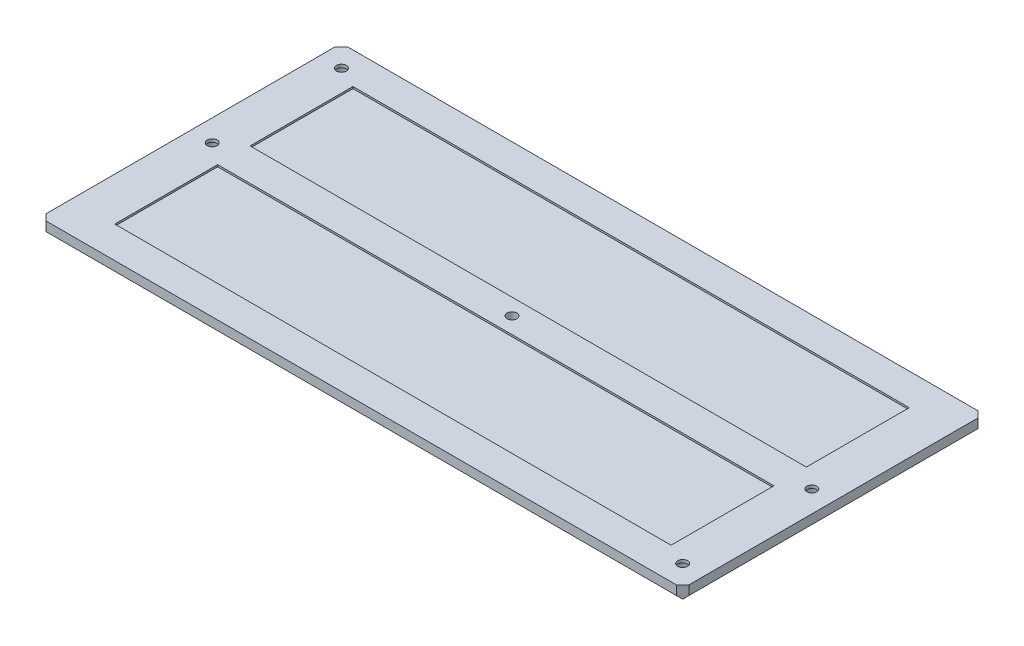
ISO-10303-21;
HEADER;
FILE_DESCRIPTION(('STEP AP214'),'2;1');
FILE_NAME('part.step','',(''),(''),'','','');
FILE_SCHEMA(('AUTOMOTIVE_DESIGN { 1 0 10303 214 1 1 1 1 }'));
ENDSEC;
DATA;
#1=APPLICATION_CONTEXT('core data for automotive mechanical design processes');
#2=APPLICATION_PROTOCOL_DEFINITION('international standard','automotive_design',2000,#1);
#3=PRODUCT_CONTEXT('',#1,'mechanical');
#4=PRODUCT('Part','Part','',(#3));
#5=PRODUCT_RELATED_PRODUCT_CATEGORY('part','',(#4));
#6=PRODUCT_DEFINITION_FORMATION('','',#4);
#7=PRODUCT_DEFINITION_CONTEXT('part definition',#1,'design');
#8=PRODUCT_DEFINITION('design','',#6,#7);
#9=PRODUCT_DEFINITION_SHAPE('','',#8);
#10=(LENGTH_UNIT() NAMED_UNIT(*) SI_UNIT(.MILLI.,.METRE.));
#11=(NAMED_UNIT(*) PLANE_ANGLE_UNIT() SI_UNIT($,.RADIAN.));
#12=(NAMED_UNIT(*) SI_UNIT($,.STERADIAN.) SOLID_ANGLE_UNIT());
#13=UNCERTAINTY_MEASURE_WITH_UNIT(LENGTH_MEASURE(1.E-05),#10,'distance_accuracy_value','');
#14=(GEOMETRIC_REPRESENTATION_CONTEXT(3) GLOBAL_UNCERTAINTY_ASSIGNED_CONTEXT((#13)) GLOBAL_UNIT_ASSIGNED_CONTEXT((#10,
#11,#12)) REPRESENTATION_CONTEXT('',''));
#15=CARTESIAN_POINT('',(0.,0.,0.));
#16=DIRECTION('',(0.,0.,1.));
#17=DIRECTION('',(1.,0.,0.));
#18=AXIS2_PLACEMENT_3D('',#15,#16,#17);
#19=CARTESIAN_POINT('',(208.,-37.,0.));
#20=DIRECTION('',(0.,-1.,0.));
#21=DIRECTION('',(0.,0.,-1.));
#22=AXIS2_PLACEMENT_3D('',#19,#20,#21);
#23=PLANE('',#22);
#24=CARTESIAN_POINT('',(201.,-37.,-7.));
#25=DIRECTION('',(0.,-1.,0.));
#26=DIRECTION('',(0.,0.,-1.));
#27=AXIS2_PLACEMENT_3D('',#24,#25,#26);
#28=CIRCLE('',#27,1.59999999999999);
#29=CARTESIAN_POINT('',(201.,-37.,-8.59999999999999));
#30=VERTEX_POINT('',#29);
#31=EDGE_CURVE('E208',#30,#30,#28,.T.);
#32=ORIENTED_EDGE('',*,*,#31,.T.);
#33=EDGE_LOOP('',(#32));
#34=FACE_BOUND('',#33,.T.);
#35=CARTESIAN_POINT('',(7.,-37.,-48.7846096908266));
#36=DIRECTION('',(0.,-1.,0.));
#37=DIRECTION('',(0.,0.,-1.));
#38=AXIS2_PLACEMENT_3D('',#35,#36,#37);
#39=CIRCLE('',#38,1.6);
#40=CARTESIAN_POINT('',(7.,-37.,-50.3846096908266));
#41=VERTEX_POINT('',#40);
#42=EDGE_CURVE('E329',#41,#41,#39,.T.);
#43=ORIENTED_EDGE('',*,*,#42,.T.);
#44=EDGE_LOOP('',(#43));
#45=FACE_BOUND('',#44,.T.);
#46=CARTESIAN_POINT('',(201.026992796734,-37.,-48.7846096908266));
#47=DIRECTION('',(0.,-1.,0.));
#48=DIRECTION('',(0.,0.,-1.));
#49=AXIS2_PLACEMENT_3D('',#46,#47,#48);
#50=CIRCLE('',#49,1.59999999999999);
#51=CARTESIAN_POINT('',(201.026992796734,-37.,-50.3846096908265));
#52=VERTEX_POINT('',#51);
#53=EDGE_CURVE('E326',#52,#52,#50,.T.);
#54=ORIENTED_EDGE('',*,*,#53,.T.);
#55=EDGE_LOOP('',(#54));
#56=FACE_BOUND('',#55,.T.);
#57=CARTESIAN_POINT('',(7.,-37.,-90.5692193816531));
#58=DIRECTION('',(0.,-1.,0.));
#59=DIRECTION('',(0.,0.,-1.));
#60=AXIS2_PLACEMENT_3D('',#57,#58,#59);
#61=CIRCLE('',#60,1.6);
#62=CARTESIAN_POINT('',(7.,-37.,-92.1692193816531));
#63=VERTEX_POINT('',#62);
#64=EDGE_CURVE('E318',#63,#63,#61,.T.);
#65=ORIENTED_EDGE('',*,*,#64,.T.);
#66=EDGE_LOOP('',(#65));
#67=FACE_BOUND('',#66,.T.);
#68=CARTESIAN_POINT('',(104.,-37.,-48.7846096908266));
#69=DIRECTION('',(0.,-1.,0.));
#70=DIRECTION('',(0.,0.,-1.));
#71=AXIS2_PLACEMENT_3D('',#68,#69,#70);
#72=CIRCLE('',#71,1.60000000000001);
#73=CARTESIAN_POINT('',(104.,-37.,-50.3846096908266));
#74=VERTEX_POINT('',#73);
#75=EDGE_CURVE('E313',#74,#74,#72,.T.);
#76=ORIENTED_EDGE('',*,*,#75,.T.);
#77=EDGE_LOOP('',(#76));
#78=FACE_BOUND('',#77,.T.);
#79=DIRECTION('',(-1.,0.,0.));
#80=VECTOR('',#79,1.);
#81=CARTESIAN_POINT('',(208.,-37.,0.));
#82=LINE('',#81,#80);
#83=CARTESIAN_POINT('',(206.,-37.,0.));
#84=VERTEX_POINT('',#83);
#85=CARTESIAN_POINT('',(2.,-37.,0.));
#86=VERTEX_POINT('',#85);
#87=EDGE_CURVE('E229',#84,#86,#82,.T.);
#88=ORIENTED_EDGE('',*,*,#87,.F.);
#89=DIRECTION('',(-0.707106781186548,0.,0.707106781186548));
#90=VECTOR('',#89,1.);
#91=CARTESIAN_POINT('',(208.,-37.,-2.));
#92=LINE('',#91,#90);
#93=CARTESIAN_POINT('',(208.,-37.,-2.));
#94=VERTEX_POINT('',#93);
#95=EDGE_CURVE('E285',#84,#94,#92,.F.);
#96=ORIENTED_EDGE('',*,*,#95,.T.);
#97=DIRECTION('',(0.,0.,1.));
#98=VECTOR('',#97,1.);
#99=CARTESIAN_POINT('',(208.,-37.,0.));
#100=LINE('',#99,#98);
#101=CARTESIAN_POINT('',(208.,-37.,-95.5692193816532));
#102=VERTEX_POINT('',#101);
#103=EDGE_CURVE('E193',#102,#94,#100,.T.);
#104=ORIENTED_EDGE('',*,*,#103,.F.);
#105=DIRECTION('',(0.707106781186557,0.,0.707106781186538));
#106=VECTOR('',#105,1.);
#107=CARTESIAN_POINT('',(208.,-37.,-95.5692193816532));
#108=LINE('',#107,#106);
#109=CARTESIAN_POINT('',(206.,-37.,-97.5692193816531));
#110=VERTEX_POINT('',#109);
#111=EDGE_CURVE('E283',#102,#110,#108,.F.);
#112=ORIENTED_EDGE('',*,*,#111,.T.);
#113=DIRECTION('',(-1.,0.,0.));
#114=VECTOR('',#113,1.);
#115=CARTESIAN_POINT('',(208.,-37.,-97.5692193816531));
#116=LINE('',#115,#114);
#117=CARTESIAN_POINT('',(2.,-37.,-97.5692193816531));
#118=VERTEX_POINT('',#117);
#119=EDGE_CURVE('E233',#110,#118,#116,.T.);
#120=ORIENTED_EDGE('',*,*,#119,.T.);
#121=DIRECTION('',(-0.707106781186548,0.,0.707106781186548));
#122=VECTOR('',#121,1.);
#123=CARTESIAN_POINT('',(2.,-37.,-97.5692193816531));
#124=LINE('',#123,#122);
#125=CARTESIAN_POINT('',(0.,-37.,-95.5692193816531));
#126=VERTEX_POINT('',#125);
#127=EDGE_CURVE('E281',#118,#126,#124,.T.);
#128=ORIENTED_EDGE('',*,*,#127,.T.);
#129=DIRECTION('',(0.,0.,1.));
#130=VECTOR('',#129,1.);
#131=CARTESIAN_POINT('',(0.,-37.,0.));
#132=LINE('',#131,#130);
#133=CARTESIAN_POINT('',(0.,-37.,-2.));
#134=VERTEX_POINT('',#133);
#135=EDGE_CURVE('E189',#126,#134,#132,.T.);
#136=ORIENTED_EDGE('',*,*,#135,.T.);
#137=DIRECTION('',(0.707106781186548,0.,0.707106781186548));
#138=VECTOR('',#137,1.);
#139=CARTESIAN_POINT('',(2.,-37.,0.));
#140=LINE('',#139,#138);
#141=EDGE_CURVE('E279',#134,#86,#140,.T.);
#142=ORIENTED_EDGE('',*,*,#141,.T.);
#143=EDGE_LOOP('',(#88,#96,#104,#112,#120,#128,#136,#142));
#144=FACE_BOUND('',#143,.T.);
#145=DIRECTION('',(-1.,0.,0.));
#146=VECTOR('',#145,1.);
#147=CARTESIAN_POINT('',(208.,-37.,-43.5346096908266));
#148=LINE('',#147,#146);
#149=CARTESIAN_POINT('',(194.,-37.,-43.5346096908266));
#150=VERTEX_POINT('',#149);
#151=CARTESIAN_POINT('',(14.,-37.,-43.5346096908266));
#152=VERTEX_POINT('',#151);
#153=EDGE_CURVE('E216',#150,#152,#148,.T.);
#154=ORIENTED_EDGE('',*,*,#153,.F.);
#155=DIRECTION('',(0.,0.,-1.));
#156=VECTOR('',#155,1.);
#157=CARTESIAN_POINT('',(194.,-37.,0.));
#158=LINE('',#157,#156);
#159=CARTESIAN_POINT('',(194.,-37.,-10.25));
#160=VERTEX_POINT('',#159);
#161=EDGE_CURVE('E67',#160,#150,#158,.T.);
#162=ORIENTED_EDGE('',*,*,#161,.F.);
#163=DIRECTION('',(-1.,0.,0.));
#164=VECTOR('',#163,1.);
#165=CARTESIAN_POINT('',(208.,-37.,-10.25));
#166=LINE('',#165,#164);
#167=CARTESIAN_POINT('',(14.,-37.,-10.25));
#168=VERTEX_POINT('',#167);
#169=EDGE_CURVE('E209',#160,#168,#166,.T.);
#170=ORIENTED_EDGE('',*,*,#169,.T.);
#171=DIRECTION('',(0.,0.,-1.));
#172=VECTOR('',#171,1.);
#173=CARTESIAN_POINT('',(14.,-37.,0.));
#174=LINE('',#173,#172);
#175=EDGE_CURVE('E212',#168,#152,#174,.T.);
#176=ORIENTED_EDGE('',*,*,#175,.T.);
#177=EDGE_LOOP('',(#154,#162,#170,#176));
#178=FACE_BOUND('',#177,.T.);
#179=DIRECTION('',(0.,0.,1.));
#180=VECTOR('',#179,1.);
#181=CARTESIAN_POINT('',(194.,-37.,0.));
#182=LINE('',#181,#180);
#183=CARTESIAN_POINT('',(194.,-37.,-87.3192193816531));
#184=VERTEX_POINT('',#183);
#185=CARTESIAN_POINT('',(194.,-37.,-54.0346096908266));
#186=VERTEX_POINT('',#185);
#187=EDGE_CURVE('E59',#184,#186,#182,.T.);
#188=ORIENTED_EDGE('',*,*,#187,.T.);
#189=DIRECTION('',(-1.,0.,0.));
#190=VECTOR('',#189,1.);
#191=CARTESIAN_POINT('',(208.,-37.,-54.0346096908266));
#192=LINE('',#191,#190);
#193=CARTESIAN_POINT('',(14.,-37.,-54.0346096908266));
#194=VERTEX_POINT('',#193);
#195=EDGE_CURVE('E188',#186,#194,#192,.T.);
#196=ORIENTED_EDGE('',*,*,#195,.T.);
#197=DIRECTION('',(0.,0.,1.));
#198=VECTOR('',#197,1.);
#199=CARTESIAN_POINT('',(14.,-37.,0.));
#200=LINE('',#199,#198);
#201=CARTESIAN_POINT('',(14.,-37.,-87.3192193816531));
#202=VERTEX_POINT('',#201);
#203=EDGE_CURVE('E339',#202,#194,#200,.T.);
#204=ORIENTED_EDGE('',*,*,#203,.F.);
#205=DIRECTION('',(-1.,0.,0.));
#206=VECTOR('',#205,1.);
#207=CARTESIAN_POINT('',(208.,-37.,-87.3192193816531));
#208=LINE('',#207,#206);
#209=EDGE_CURVE('E184',#184,#202,#208,.T.);
#210=ORIENTED_EDGE('',*,*,#209,.F.);
#211=EDGE_LOOP('',(#188,#196,#204,#210));
#212=FACE_BOUND('',#211,.T.);
#213=ADVANCED_FACE('F41',(#34,#45,#56,#67,#78,#144,#178,#212),#23,.F.);
#214=CARTESIAN_POINT('',(208.,-41.,0.));
#215=DIRECTION('',(0.,0.,-1.));
#216=DIRECTION('',(-1.,0.,0.));
#217=AXIS2_PLACEMENT_3D('',#214,#215,#216);
#218=PLANE('',#217);
#219=DIRECTION('',(1.,0.,0.));
#220=VECTOR('',#219,1.);
#221=CARTESIAN_POINT('',(208.,-40.,0.));
#222=LINE('',#221,#220);
#223=CARTESIAN_POINT('',(2.,-40.,0.));
#224=VERTEX_POINT('',#223);
#225=CARTESIAN_POINT('',(206.,-40.,0.));
#226=VERTEX_POINT('',#225);
#227=EDGE_CURVE('E251',#224,#226,#222,.T.);
#228=ORIENTED_EDGE('',*,*,#227,.T.);
#229=DIRECTION('',(0.,1.,0.));
#230=VECTOR('',#229,1.);
#231=CARTESIAN_POINT('',(206.,-41.,0.));
#232=LINE('',#231,#230);
#233=EDGE_CURVE('E277',#226,#84,#232,.T.);
#234=ORIENTED_EDGE('',*,*,#233,.T.);
#235=ORIENTED_EDGE('',*,*,#87,.T.);
#236=DIRECTION('',(0.,-1.,0.));
#237=VECTOR('',#236,1.);
#238=CARTESIAN_POINT('',(2.,-40.,0.));
#239=LINE('',#238,#237);
#240=EDGE_CURVE('E274',#86,#224,#239,.T.);
#241=ORIENTED_EDGE('',*,*,#240,.T.);
#242=EDGE_LOOP('',(#228,#234,#235,#241));
#243=FACE_BOUND('',#242,.T.);
#244=ADVANCED_FACE('F352',(#243),#218,.F.);
#245=CARTESIAN_POINT('',(208.,-41.,0.));
#246=DIRECTION('',(0.,1.,0.));
#247=DIRECTION('',(0.,0.,1.));
#248=AXIS2_PLACEMENT_3D('',#245,#246,#247);
#249=PLANE('',#248);
#250=CARTESIAN_POINT('',(7.,-41.,-90.5692193816531));
#251=DIRECTION('',(0.,1.,0.));
#252=DIRECTION('',(0.,0.,1.));
#253=AXIS2_PLACEMENT_3D('',#250,#251,#252);
#254=CIRCLE('',#253,3.6);
#255=CARTESIAN_POINT('',(7.,-41.,-86.9692193816531));
#256=VERTEX_POINT('',#255);
#257=EDGE_CURVE('E546',#256,#256,#254,.T.);
#258=ORIENTED_EDGE('',*,*,#257,.T.);
#259=EDGE_LOOP('',(#258));
#260=FACE_BOUND('',#259,.T.);
#261=CARTESIAN_POINT('',(7.,-41.,-48.7846096908266));
#262=DIRECTION('',(0.,1.,0.));
#263=DIRECTION('',(0.,0.,1.));
#264=AXIS2_PLACEMENT_3D('',#261,#262,#263);
#265=CIRCLE('',#264,3.6);
#266=CARTESIAN_POINT('',(7.,-41.,-45.1846096908266));
#267=VERTEX_POINT('',#266);
#268=EDGE_CURVE('E547',#267,#267,#265,.T.);
#269=ORIENTED_EDGE('',*,*,#268,.T.);
#270=EDGE_LOOP('',(#269));
#271=FACE_BOUND('',#270,.T.);
#272=CARTESIAN_POINT('',(201.026992796734,-41.,-48.7846096908266));
#273=DIRECTION('',(0.,1.,0.));
#274=DIRECTION('',(0.,0.,1.));
#275=AXIS2_PLACEMENT_3D('',#272,#273,#274);
#276=CIRCLE('',#275,3.59999999999999);
#277=CARTESIAN_POINT('',(201.026992796734,-41.,-45.1846096908266));
#278=VERTEX_POINT('',#277);
#279=EDGE_CURVE('E558',#278,#278,#276,.T.);
#280=ORIENTED_EDGE('',*,*,#279,.T.);
#281=EDGE_LOOP('',(#280));
#282=FACE_BOUND('',#281,.T.);
#283=CARTESIAN_POINT('',(201.,-41.,-7.));
#284=DIRECTION('',(0.,1.,0.));
#285=DIRECTION('',(0.,0.,1.));
#286=AXIS2_PLACEMENT_3D('',#283,#284,#285);
#287=CIRCLE('',#286,3.59999999999999);
#288=CARTESIAN_POINT('',(201.,-41.,-3.40000000000001));
#289=VERTEX_POINT('',#288);
#290=EDGE_CURVE('E563',#289,#289,#287,.T.);
#291=ORIENTED_EDGE('',*,*,#290,.T.);
#292=EDGE_LOOP('',(#291));
#293=FACE_BOUND('',#292,.T.);
#294=CARTESIAN_POINT('',(104.,-41.,-48.7846096908266));
#295=DIRECTION('',(0.,1.,0.));
#296=DIRECTION('',(0.,0.,1.));
#297=AXIS2_PLACEMENT_3D('',#294,#295,#296);
#298=CIRCLE('',#297,1.60000000000001);
#299=CARTESIAN_POINT('',(104.,-41.,-47.1846096908265));
#300=VERTEX_POINT('',#299);
#301=EDGE_CURVE('E309',#300,#300,#298,.T.);
#302=ORIENTED_EDGE('',*,*,#301,.T.);
#303=EDGE_LOOP('',(#302));
#304=FACE_BOUND('',#303,.T.);
#305=DIRECTION('',(-1.,0.,0.));
#306=VECTOR('',#305,1.);
#307=CARTESIAN_POINT('',(208.,-41.,-1.));
#308=LINE('',#307,#306);
#309=CARTESIAN_POINT('',(207.,-41.,-1.));
#310=VERTEX_POINT('',#309);
#311=CARTESIAN_POINT('',(1.,-41.,-1.));
#312=VERTEX_POINT('',#311);
#313=EDGE_CURVE('E242',#310,#312,#308,.T.);
#314=ORIENTED_EDGE('',*,*,#313,.T.);
#315=DIRECTION('',(0.,0.,-1.));
#316=VECTOR('',#315,1.);
#317=CARTESIAN_POINT('',(1.,-41.,-97.5692193816531));
#318=LINE('',#317,#316);
#319=CARTESIAN_POINT('',(1.,-41.,-96.5692193816531));
#320=VERTEX_POINT('',#319);
#321=EDGE_CURVE('E245',#312,#320,#318,.T.);
#322=ORIENTED_EDGE('',*,*,#321,.T.);
#323=DIRECTION('',(1.,0.,0.));
#324=VECTOR('',#323,1.);
#325=CARTESIAN_POINT('',(208.,-41.,-96.5692193816531));
#326=LINE('',#325,#324);
#327=CARTESIAN_POINT('',(207.,-41.,-96.5692193816531));
#328=VERTEX_POINT('',#327);
#329=EDGE_CURVE('E236',#320,#328,#326,.T.);
#330=ORIENTED_EDGE('',*,*,#329,.T.);
#331=DIRECTION('',(0.,0.,1.));
#332=VECTOR('',#331,1.);
#333=CARTESIAN_POINT('',(207.,-41.,0.));
#334=LINE('',#333,#332);
#335=EDGE_CURVE('E239',#328,#310,#334,.T.);
#336=ORIENTED_EDGE('',*,*,#335,.T.);
#337=EDGE_LOOP('',(#314,#322,#330,#336));
#338=FACE_BOUND('',#337,.T.);
#339=ADVANCED_FACE('F358',(#260,#271,#282,#293,#304,#338),#249,.F.);
#340=CARTESIAN_POINT('',(208.,-41.,-97.5692193816531));
#341=DIRECTION('',(0.,0.,1.));
#342=DIRECTION('',(1.,0.,0.));
#343=AXIS2_PLACEMENT_3D('',#340,#341,#342);
#344=PLANE('',#343);
#345=ORIENTED_EDGE('',*,*,#119,.F.);
#346=DIRECTION('',(0.,-1.,0.));
#347=VECTOR('',#346,1.);
#348=CARTESIAN_POINT('',(206.,-41.,-97.5692193816531));
#349=LINE('',#348,#347);
#350=CARTESIAN_POINT('',(206.,-40.,-97.5692193816531));
#351=VERTEX_POINT('',#350);
#352=EDGE_CURVE('E290',#110,#351,#349,.T.);
#353=ORIENTED_EDGE('',*,*,#352,.T.);
#354=DIRECTION('',(-1.,0.,0.));
#355=VECTOR('',#354,1.);
#356=CARTESIAN_POINT('',(208.,-40.,-97.5692193816531));
#357=LINE('',#356,#355);
#358=CARTESIAN_POINT('',(2.,-40.,-97.5692193816531));
#359=VERTEX_POINT('',#358);
#360=EDGE_CURVE('E257',#351,#359,#357,.T.);
#361=ORIENTED_EDGE('',*,*,#360,.T.);
#362=DIRECTION('',(0.,1.,0.));
#363=VECTOR('',#362,1.);
#364=CARTESIAN_POINT('',(2.,-37.,-97.5692193816531));
#365=LINE('',#364,#363);
#366=EDGE_CURVE('E287',#359,#118,#365,.T.);
#367=ORIENTED_EDGE('',*,*,#366,.T.);
#368=EDGE_LOOP('',(#345,#353,#361,#367));
#369=FACE_BOUND('',#368,.T.);
#370=ADVANCED_FACE('F366',(#369),#344,.F.);
#371=CARTESIAN_POINT('',(208.,0.,0.));
#372=DIRECTION('',(-1.,0.,0.));
#373=DIRECTION('',(0.,0.,1.));
#374=AXIS2_PLACEMENT_3D('',#371,#372,#373);
#375=PLANE('',#374);
#376=ORIENTED_EDGE('',*,*,#103,.T.);
#377=DIRECTION('',(0.,-1.,0.));
#378=VECTOR('',#377,1.);
#379=CARTESIAN_POINT('',(208.,0.,-2.));
#380=LINE('',#379,#378);
#381=CARTESIAN_POINT('',(208.,-40.,-2.));
#382=VERTEX_POINT('',#381);
#383=EDGE_CURVE('E263',#94,#382,#380,.T.);
#384=ORIENTED_EDGE('',*,*,#383,.T.);
#385=DIRECTION('',(0.,0.,-1.));
#386=VECTOR('',#385,1.);
#387=CARTESIAN_POINT('',(208.,-40.,0.));
#388=LINE('',#387,#386);
#389=CARTESIAN_POINT('',(208.,-40.,-95.5692193816532));
#390=VERTEX_POINT('',#389);
#391=EDGE_CURVE('E254',#382,#390,#388,.T.);
#392=ORIENTED_EDGE('',*,*,#391,.T.);
#393=DIRECTION('',(0.,1.,0.));
#394=VECTOR('',#393,1.);
#395=CARTESIAN_POINT('',(208.,0.,-95.5692193816532));
#396=LINE('',#395,#394);
#397=EDGE_CURVE('E260',#390,#102,#396,.T.);
#398=ORIENTED_EDGE('',*,*,#397,.T.);
#399=EDGE_LOOP('',(#376,#384,#392,#398));
#400=FACE_BOUND('',#399,.T.);
#401=ADVANCED_FACE('F369',(#400),#375,.F.);
#402=CARTESIAN_POINT('',(0.,0.,0.));
#403=DIRECTION('',(-1.,0.,0.));
#404=DIRECTION('',(0.,0.,1.));
#405=AXIS2_PLACEMENT_3D('',#402,#403,#404);
#406=PLANE('',#405);
#407=ORIENTED_EDGE('',*,*,#135,.F.);
#408=DIRECTION('',(0.,-1.,0.));
#409=VECTOR('',#408,1.);
#410=CARTESIAN_POINT('',(0.,-40.,-95.5692193816531));
#411=LINE('',#410,#409);
#412=CARTESIAN_POINT('',(0.,-40.,-95.5692193816531));
#413=VERTEX_POINT('',#412);
#414=EDGE_CURVE('E298',#126,#413,#411,.T.);
#415=ORIENTED_EDGE('',*,*,#414,.T.);
#416=DIRECTION('',(0.,0.,1.));
#417=VECTOR('',#416,1.);
#418=CARTESIAN_POINT('',(0.,-40.,0.));
#419=LINE('',#418,#417);
#420=CARTESIAN_POINT('',(0.,-40.,-2.));
#421=VERTEX_POINT('',#420);
#422=EDGE_CURVE('E248',#413,#421,#419,.T.);
#423=ORIENTED_EDGE('',*,*,#422,.T.);
#424=DIRECTION('',(0.,1.,0.));
#425=VECTOR('',#424,1.);
#426=CARTESIAN_POINT('',(0.,-37.,-2.));
#427=LINE('',#426,#425);
#428=EDGE_CURVE('E296',#421,#134,#427,.T.);
#429=ORIENTED_EDGE('',*,*,#428,.T.);
#430=EDGE_LOOP('',(#407,#415,#423,#429));
#431=FACE_BOUND('',#430,.T.);
#432=ADVANCED_FACE('F364',(#431),#406,.T.);
#433=CARTESIAN_POINT('',(208.,-40.,0.));
#434=DIRECTION('',(-0.707106781186547,0.707106781186547,0.));
#435=DIRECTION('',(0.,0.,-1.));
#436=AXIS2_PLACEMENT_3D('',#433,#434,#435);
#437=PLANE('',#436);
#438=ORIENTED_EDGE('',*,*,#391,.F.);
#439=DIRECTION('',(-0.577350269189626,-0.577350269189626,0.577350269189626));
#440=VECTOR('',#439,1.);
#441=CARTESIAN_POINT('',(207.333333333333,-40.6666666666667,-1.33333333333333));
#442=LINE('',#441,#440);
#443=EDGE_CURVE('E268',#382,#310,#442,.T.);
#444=ORIENTED_EDGE('',*,*,#443,.T.);
#445=ORIENTED_EDGE('',*,*,#335,.F.);
#446=DIRECTION('',(0.577350269189631,0.577350269189631,0.577350269189615));
#447=VECTOR('',#446,1.);
#448=CARTESIAN_POINT('',(239.85640646055,-8.14359353944928,-63.7128129211033));
#449=LINE('',#448,#447);
#450=EDGE_CURVE('E266',#328,#390,#449,.T.);
#451=ORIENTED_EDGE('',*,*,#450,.T.);
#452=EDGE_LOOP('',(#438,#444,#445,#451));
#453=FACE_BOUND('',#452,.T.);
#454=ADVANCED_FACE('F397',(#453),#437,.F.);
#455=CARTESIAN_POINT('',(208.,-41.,-1.));
#456=DIRECTION('',(0.,0.707106781186547,-0.707106781186547));
#457=DIRECTION('',(-1.,0.,0.));
#458=AXIS2_PLACEMENT_3D('',#455,#456,#457);
#459=PLANE('',#458);
#460=ORIENTED_EDGE('',*,*,#313,.F.);
#461=DIRECTION('',(-0.577350269189626,0.577350269189626,0.577350269189626));
#462=VECTOR('',#461,1.);
#463=CARTESIAN_POINT('',(207.333333333333,-41.3333333333334,-1.33333333333333));
#464=LINE('',#463,#462);
#465=EDGE_CURVE('E272',#310,#226,#464,.T.);
#466=ORIENTED_EDGE('',*,*,#465,.T.);
#467=ORIENTED_EDGE('',*,*,#227,.F.);
#468=DIRECTION('',(0.577350269189626,0.577350269189626,0.577350269189626));
#469=VECTOR('',#468,1.);
#470=CARTESIAN_POINT('',(69.9999999999999,27.9999999999999,67.9999999999999));
#471=LINE('',#470,#469);
#472=EDGE_CURVE('E270',#224,#312,#471,.F.);
#473=ORIENTED_EDGE('',*,*,#472,.T.);
#474=EDGE_LOOP('',(#460,#466,#467,#473));
#475=FACE_BOUND('',#474,.T.);
#476=ADVANCED_FACE('F390',(#475),#459,.F.);
#477=CARTESIAN_POINT('',(208.,-40.,-97.5692193816531));
#478=DIRECTION('',(0.,0.707106781186547,0.707106781186547));
#479=DIRECTION('',(-1.,0.,0.));
#480=AXIS2_PLACEMENT_3D('',#477,#478,#479);
#481=PLANE('',#480);
#482=ORIENTED_EDGE('',*,*,#360,.F.);
#483=DIRECTION('',(0.577350269189637,-0.577350269189621,0.577350269189621));
#484=VECTOR('',#483,1.);
#485=CARTESIAN_POINT('',(206.666666666666,-40.6666666666667,-96.9025527149864));
#486=LINE('',#485,#484);
#487=EDGE_CURVE('E294',#351,#328,#486,.T.);
#488=ORIENTED_EDGE('',*,*,#487,.T.);
#489=ORIENTED_EDGE('',*,*,#329,.F.);
#490=DIRECTION('',(-0.577350269189626,-0.577350269189626,0.577350269189626));
#491=VECTOR('',#490,1.);
#492=CARTESIAN_POINT('',(70.6666666666666,28.6666666666665,-166.23588604832));
#493=LINE('',#492,#491);
#494=EDGE_CURVE('E292',#320,#359,#493,.F.);
#495=ORIENTED_EDGE('',*,*,#494,.T.);
#496=EDGE_LOOP('',(#482,#488,#489,#495));
#497=FACE_BOUND('',#496,.T.);
#498=ADVANCED_FACE('F383',(#497),#481,.F.);
#499=CARTESIAN_POINT('',(1.,-41.,0.));
#500=DIRECTION('',(-0.707106781186547,-0.707106781186547,0.));
#501=DIRECTION('',(0.,0.,1.));
#502=AXIS2_PLACEMENT_3D('',#499,#500,#501);
#503=PLANE('',#502);
#504=ORIENTED_EDGE('',*,*,#422,.F.);
#505=DIRECTION('',(0.577350269189626,-0.577350269189626,-0.577350269189626));
#506=VECTOR('',#505,1.);
#507=CARTESIAN_POINT('',(-31.1897397938844,-8.81026020611567,-64.3794795877687));
#508=LINE('',#507,#506);
#509=EDGE_CURVE('E12',#413,#320,#508,.T.);
#510=ORIENTED_EDGE('',*,*,#509,.T.);
#511=ORIENTED_EDGE('',*,*,#321,.F.);
#512=DIRECTION('',(-0.577350269189626,0.577350269189626,-0.577350269189626));
#513=VECTOR('',#512,1.);
#514=CARTESIAN_POINT('',(1.33333333333333,-41.3333333333334,-0.666666666666667));
#515=LINE('',#514,#513);
#516=EDGE_CURVE('E51',#312,#421,#515,.T.);
#517=ORIENTED_EDGE('',*,*,#516,.T.);
#518=EDGE_LOOP('',(#504,#510,#511,#517));
#519=FACE_BOUND('',#518,.T.);
#520=ADVANCED_FACE('F375',(#519),#503,.T.);
#521=CARTESIAN_POINT('',(208.,0.,-2.));
#522=DIRECTION('',(-0.707106781186547,0.,-0.707106781186547));
#523=DIRECTION('',(0.,-1.,0.));
#524=AXIS2_PLACEMENT_3D('',#521,#522,#523);
#525=PLANE('',#524);
#526=ORIENTED_EDGE('',*,*,#95,.F.);
#527=ORIENTED_EDGE('',*,*,#233,.F.);
#528=ORIENTED_EDGE('',*,*,#465,.F.);
#529=ORIENTED_EDGE('',*,*,#443,.F.);
#530=ORIENTED_EDGE('',*,*,#383,.F.);
#531=EDGE_LOOP('',(#526,#527,#528,#529,#530));
#532=FACE_BOUND('',#531,.T.);
#533=ADVANCED_FACE('F382',(#532),#525,.F.);
#534=CARTESIAN_POINT('',(208.,0.,-95.5692193816532));
#535=DIRECTION('',(-0.707106781186538,0.,0.707106781186557));
#536=DIRECTION('',(0.,1.,0.));
#537=AXIS2_PLACEMENT_3D('',#534,#535,#536);
#538=PLANE('',#537);
#539=ORIENTED_EDGE('',*,*,#487,.F.);
#540=ORIENTED_EDGE('',*,*,#352,.F.);
#541=ORIENTED_EDGE('',*,*,#111,.F.);
#542=ORIENTED_EDGE('',*,*,#397,.F.);
#543=ORIENTED_EDGE('',*,*,#450,.F.);
#544=EDGE_LOOP('',(#539,#540,#541,#542,#543));
#545=FACE_BOUND('',#544,.T.);
#546=ADVANCED_FACE('F409',(#545),#538,.F.);
#547=CARTESIAN_POINT('',(2.,-41.,-97.5692193816531));
#548=DIRECTION('',(-0.707106781186547,0.,-0.707106781186547));
#549=DIRECTION('',(0.,-1.,0.));
#550=AXIS2_PLACEMENT_3D('',#547,#548,#549);
#551=PLANE('',#550);
#552=ORIENTED_EDGE('',*,*,#509,.F.);
#553=ORIENTED_EDGE('',*,*,#414,.F.);
#554=ORIENTED_EDGE('',*,*,#127,.F.);
#555=ORIENTED_EDGE('',*,*,#366,.F.);
#556=ORIENTED_EDGE('',*,*,#494,.F.);
#557=EDGE_LOOP('',(#552,#553,#554,#555,#556));
#558=FACE_BOUND('',#557,.T.);
#559=ADVANCED_FACE('F415',(#558),#551,.T.);
#560=CARTESIAN_POINT('',(2.,-41.,0.));
#561=DIRECTION('',(-0.707106781186547,0.,0.707106781186547));
#562=DIRECTION('',(0.,1.,0.));
#563=AXIS2_PLACEMENT_3D('',#560,#561,#562);
#564=PLANE('',#563);
#565=ORIENTED_EDGE('',*,*,#141,.F.);
#566=ORIENTED_EDGE('',*,*,#428,.F.);
#567=ORIENTED_EDGE('',*,*,#516,.F.);
#568=ORIENTED_EDGE('',*,*,#472,.F.);
#569=ORIENTED_EDGE('',*,*,#240,.F.);
#570=EDGE_LOOP('',(#565,#566,#567,#568,#569));
#571=FACE_BOUND('',#570,.T.);
#572=ADVANCED_FACE('F44',(#571),#564,.T.);
#573=CARTESIAN_POINT('',(194.,-37.6,0.));
#574=DIRECTION('',(1.,0.,0.));
#575=DIRECTION('',(0.,0.,-1.));
#576=AXIS2_PLACEMENT_3D('',#573,#574,#575);
#577=PLANE('',#576);
#578=ORIENTED_EDGE('',*,*,#161,.T.);
#579=DIRECTION('',(0.,1.,0.));
#580=VECTOR('',#579,1.);
#581=CARTESIAN_POINT('',(194.,-37.6,-43.5346096908266));
#582=LINE('',#581,#580);
#583=CARTESIAN_POINT('',(194.,-37.6,-43.5346096908266));
#584=VERTEX_POINT('',#583);
#585=EDGE_CURVE('E199',#584,#150,#582,.T.);
#586=ORIENTED_EDGE('',*,*,#585,.F.);
#587=DIRECTION('',(0.,0.,-1.));
#588=VECTOR('',#587,1.);
#589=CARTESIAN_POINT('',(194.,-37.6,0.));
#590=LINE('',#589,#588);
#591=CARTESIAN_POINT('',(194.,-37.6,-10.25));
#592=VERTEX_POINT('',#591);
#593=EDGE_CURVE('E213',#592,#584,#590,.T.);
#594=ORIENTED_EDGE('',*,*,#593,.F.);
#595=DIRECTION('',(0.,1.,0.));
#596=VECTOR('',#595,1.);
#597=CARTESIAN_POINT('',(194.,-37.6,-10.25));
#598=LINE('',#597,#596);
#599=EDGE_CURVE('E206',#592,#160,#598,.T.);
#600=ORIENTED_EDGE('',*,*,#599,.T.);
#601=EDGE_LOOP('',(#578,#586,#594,#600));
#602=FACE_BOUND('',#601,.T.);
#603=ADVANCED_FACE('F424',(#602),#577,.F.);
#604=CARTESIAN_POINT('',(208.,-37.6,-10.25));
#605=DIRECTION('',(0.,0.,-1.));
#606=DIRECTION('',(-1.,0.,0.));
#607=AXIS2_PLACEMENT_3D('',#604,#605,#606);
#608=PLANE('',#607);
#609=ORIENTED_EDGE('',*,*,#169,.F.);
#610=ORIENTED_EDGE('',*,*,#599,.F.);
#611=DIRECTION('',(-1.,0.,0.));
#612=VECTOR('',#611,1.);
#613=CARTESIAN_POINT('',(208.,-37.6,-10.25));
#614=LINE('',#613,#612);
#615=CARTESIAN_POINT('',(14.,-37.6,-10.25));
#616=VERTEX_POINT('',#615);
#617=EDGE_CURVE('E201',#592,#616,#614,.T.);
#618=ORIENTED_EDGE('',*,*,#617,.T.);
#619=DIRECTION('',(0.,1.,0.));
#620=VECTOR('',#619,1.);
#621=CARTESIAN_POINT('',(14.,-37.6,-10.25));
#622=LINE('',#621,#620);
#623=EDGE_CURVE('E204',#616,#168,#622,.T.);
#624=ORIENTED_EDGE('',*,*,#623,.T.);
#625=EDGE_LOOP('',(#609,#610,#618,#624));
#626=FACE_BOUND('',#625,.T.);
#627=ADVANCED_FACE('F466',(#626),#608,.T.);
#628=CARTESIAN_POINT('',(14.,-37.6,0.));
#629=DIRECTION('',(1.,0.,0.));
#630=DIRECTION('',(0.,0.,-1.));
#631=AXIS2_PLACEMENT_3D('',#628,#629,#630);
#632=PLANE('',#631);
#633=ORIENTED_EDGE('',*,*,#175,.F.);
#634=ORIENTED_EDGE('',*,*,#623,.F.);
#635=DIRECTION('',(0.,0.,-1.));
#636=VECTOR('',#635,1.);
#637=CARTESIAN_POINT('',(14.,-37.6,0.));
#638=LINE('',#637,#636);
#639=CARTESIAN_POINT('',(14.,-37.6,-43.5346096908266));
#640=VERTEX_POINT('',#639);
#641=EDGE_CURVE('E221',#616,#640,#638,.T.);
#642=ORIENTED_EDGE('',*,*,#641,.T.);
#643=DIRECTION('',(0.,1.,0.));
#644=VECTOR('',#643,1.);
#645=CARTESIAN_POINT('',(14.,-37.6,-43.5346096908266));
#646=LINE('',#645,#644);
#647=EDGE_CURVE('E202',#640,#152,#646,.T.);
#648=ORIENTED_EDGE('',*,*,#647,.T.);
#649=EDGE_LOOP('',(#633,#634,#642,#648));
#650=FACE_BOUND('',#649,.T.);
#651=ADVANCED_FACE('F469',(#650),#632,.T.);
#652=CARTESIAN_POINT('',(208.,-37.6,-43.5346096908266));
#653=DIRECTION('',(0.,0.,-1.));
#654=DIRECTION('',(-1.,0.,0.));
#655=AXIS2_PLACEMENT_3D('',#652,#653,#654);
#656=PLANE('',#655);
#657=ORIENTED_EDGE('',*,*,#153,.T.);
#658=ORIENTED_EDGE('',*,*,#647,.F.);
#659=DIRECTION('',(-1.,0.,0.));
#660=VECTOR('',#659,1.);
#661=CARTESIAN_POINT('',(208.,-37.6,-43.5346096908266));
#662=LINE('',#661,#660);
#663=EDGE_CURVE('E223',#584,#640,#662,.T.);
#664=ORIENTED_EDGE('',*,*,#663,.F.);
#665=ORIENTED_EDGE('',*,*,#585,.T.);
#666=EDGE_LOOP('',(#657,#658,#664,#665));
#667=FACE_BOUND('',#666,.T.);
#668=ADVANCED_FACE('F464',(#667),#656,.F.);
#669=CARTESIAN_POINT('',(0.,-37.6,0.));
#670=DIRECTION('',(0.,1.,0.));
#671=DIRECTION('',(0.,0.,1.));
#672=AXIS2_PLACEMENT_3D('',#669,#670,#671);
#673=PLANE('',#672);
#674=ORIENTED_EDGE('',*,*,#593,.T.);
#675=ORIENTED_EDGE('',*,*,#663,.T.);
#676=ORIENTED_EDGE('',*,*,#641,.F.);
#677=ORIENTED_EDGE('',*,*,#617,.F.);
#678=EDGE_LOOP('',(#674,#675,#676,#677));
#679=FACE_BOUND('',#678,.T.);
#680=ADVANCED_FACE('F461',(#679),#673,.T.);
#681=CARTESIAN_POINT('',(194.,-37.6,0.));
#682=DIRECTION('',(-1.,0.,0.));
#683=DIRECTION('',(0.,0.,1.));
#684=AXIS2_PLACEMENT_3D('',#681,#682,#683);
#685=PLANE('',#684);
#686=ORIENTED_EDGE('',*,*,#187,.F.);
#687=DIRECTION('',(0.,1.,0.));
#688=VECTOR('',#687,1.);
#689=CARTESIAN_POINT('',(194.,-37.6,-87.3192193816531));
#690=LINE('',#689,#688);
#691=CARTESIAN_POINT('',(194.,-37.6,-87.3192193816531));
#692=VERTEX_POINT('',#691);
#693=EDGE_CURVE('E183',#692,#184,#690,.T.);
#694=ORIENTED_EDGE('',*,*,#693,.F.);
#695=DIRECTION('',(0.,0.,1.));
#696=VECTOR('',#695,1.);
#697=CARTESIAN_POINT('',(194.,-37.6,0.));
#698=LINE('',#697,#696);
#699=CARTESIAN_POINT('',(194.,-37.6,-54.0346096908266));
#700=VERTEX_POINT('',#699);
#701=EDGE_CURVE('E173',#692,#700,#698,.T.);
#702=ORIENTED_EDGE('',*,*,#701,.T.);
#703=DIRECTION('',(0.,1.,0.));
#704=VECTOR('',#703,1.);
#705=CARTESIAN_POINT('',(194.,-37.6,-54.0346096908266));
#706=LINE('',#705,#704);
#707=EDGE_CURVE('E182',#700,#186,#706,.T.);
#708=ORIENTED_EDGE('',*,*,#707,.T.);
#709=EDGE_LOOP('',(#686,#694,#702,#708));
#710=FACE_BOUND('',#709,.T.);
#711=ADVANCED_FACE('F181',(#710),#685,.T.);
#712=CARTESIAN_POINT('',(208.,-37.6,-54.0346096908266));
#713=DIRECTION('',(0.,0.,-1.));
#714=DIRECTION('',(-1.,0.,0.));
#715=AXIS2_PLACEMENT_3D('',#712,#713,#714);
#716=PLANE('',#715);
#717=ORIENTED_EDGE('',*,*,#195,.F.);
#718=ORIENTED_EDGE('',*,*,#707,.F.);
#719=DIRECTION('',(-1.,0.,0.));
#720=VECTOR('',#719,1.);
#721=CARTESIAN_POINT('',(208.,-37.6,-54.0346096908266));
#722=LINE('',#721,#720);
#723=CARTESIAN_POINT('',(14.,-37.6,-54.0346096908266));
#724=VERTEX_POINT('',#723);
#725=EDGE_CURVE('E169',#700,#724,#722,.T.);
#726=ORIENTED_EDGE('',*,*,#725,.T.);
#727=DIRECTION('',(0.,1.,0.));
#728=VECTOR('',#727,1.);
#729=CARTESIAN_POINT('',(14.,-37.6,-54.0346096908266));
#730=LINE('',#729,#728);
#731=EDGE_CURVE('E190',#724,#194,#730,.T.);
#732=ORIENTED_EDGE('',*,*,#731,.T.);
#733=EDGE_LOOP('',(#717,#718,#726,#732));
#734=FACE_BOUND('',#733,.T.);
#735=ADVANCED_FACE('F186',(#734),#716,.T.);
#736=CARTESIAN_POINT('',(14.,-37.6,0.));
#737=DIRECTION('',(-1.,0.,0.));
#738=DIRECTION('',(0.,0.,1.));
#739=AXIS2_PLACEMENT_3D('',#736,#737,#738);
#740=PLANE('',#739);
#741=ORIENTED_EDGE('',*,*,#203,.T.);
#742=ORIENTED_EDGE('',*,*,#731,.F.);
#743=DIRECTION('',(0.,0.,1.));
#744=VECTOR('',#743,1.);
#745=CARTESIAN_POINT('',(14.,-37.6,0.));
#746=LINE('',#745,#744);
#747=CARTESIAN_POINT('',(14.,-37.6,-87.3192193816531));
#748=VERTEX_POINT('',#747);
#749=EDGE_CURVE('E176',#748,#724,#746,.T.);
#750=ORIENTED_EDGE('',*,*,#749,.F.);
#751=DIRECTION('',(0.,1.,0.));
#752=VECTOR('',#751,1.);
#753=CARTESIAN_POINT('',(14.,-37.6,-87.3192193816531));
#754=LINE('',#753,#752);
#755=EDGE_CURVE('E195',#748,#202,#754,.T.);
#756=ORIENTED_EDGE('',*,*,#755,.T.);
#757=EDGE_LOOP('',(#741,#742,#750,#756));
#758=FACE_BOUND('',#757,.T.);
#759=ADVANCED_FACE('F345',(#758),#740,.F.);
#760=CARTESIAN_POINT('',(208.,-37.6,-87.3192193816531));
#761=DIRECTION('',(0.,0.,-1.));
#762=DIRECTION('',(-1.,0.,0.));
#763=AXIS2_PLACEMENT_3D('',#760,#761,#762);
#764=PLANE('',#763);
#765=ORIENTED_EDGE('',*,*,#209,.T.);
#766=ORIENTED_EDGE('',*,*,#755,.F.);
#767=DIRECTION('',(-1.,0.,0.));
#768=VECTOR('',#767,1.);
#769=CARTESIAN_POINT('',(208.,-37.6,-87.3192193816531));
#770=LINE('',#769,#768);
#771=EDGE_CURVE('E335',#692,#748,#770,.T.);
#772=ORIENTED_EDGE('',*,*,#771,.F.);
#773=ORIENTED_EDGE('',*,*,#693,.T.);
#774=EDGE_LOOP('',(#765,#766,#772,#773));
#775=FACE_BOUND('',#774,.T.);
#776=ADVANCED_FACE('F349',(#775),#764,.F.);
#777=CARTESIAN_POINT('',(0.,-37.6,0.));
#778=DIRECTION('',(0.,-1.,0.));
#779=DIRECTION('',(0.,0.,-1.));
#780=AXIS2_PLACEMENT_3D('',#777,#778,#779);
#781=PLANE('',#780);
#782=ORIENTED_EDGE('',*,*,#701,.F.);
#783=ORIENTED_EDGE('',*,*,#771,.T.);
#784=ORIENTED_EDGE('',*,*,#749,.T.);
#785=ORIENTED_EDGE('',*,*,#725,.F.);
#786=EDGE_LOOP('',(#782,#783,#784,#785));
#787=FACE_BOUND('',#786,.T.);
#788=ADVANCED_FACE('F171',(#787),#781,.F.);
#789=CARTESIAN_POINT('',(104.,-41.,-48.7846096908266));
#790=DIRECTION('',(0.,1.,0.));
#791=DIRECTION('',(0.,0.,1.));
#792=AXIS2_PLACEMENT_3D('',#789,#790,#791);
#793=CYLINDRICAL_SURFACE('',#792,1.60000000000001);
#794=ORIENTED_EDGE('',*,*,#301,.F.);
#795=EDGE_LOOP('',(#794));
#796=FACE_BOUND('',#795,.T.);
#797=ORIENTED_EDGE('',*,*,#75,.F.);
#798=EDGE_LOOP('',(#797));
#799=FACE_BOUND('',#798,.T.);
#800=ADVANCED_FACE('F489',(#796,#799),#793,.F.);
#801=CARTESIAN_POINT('',(7.,-41.,-90.5692193816531));
#802=DIRECTION('',(0.,1.,0.));
#803=DIRECTION('',(0.,0.,1.));
#804=AXIS2_PLACEMENT_3D('',#801,#802,#803);
#805=CYLINDRICAL_SURFACE('',#804,1.6);
#806=CARTESIAN_POINT('',(7.,-38.,-90.5692193816531));
#807=DIRECTION('',(0.,1.,0.));
#808=DIRECTION('',(0.,0.,1.));
#809=AXIS2_PLACEMENT_3D('',#806,#807,#808);
#810=CIRCLE('',#809,1.6);
#811=CARTESIAN_POINT('',(7.,-38.,-88.9692193816531));
#812=VERTEX_POINT('',#811);
#813=EDGE_CURVE('E545',#812,#812,#810,.T.);
#814=ORIENTED_EDGE('',*,*,#813,.F.);
#815=EDGE_LOOP('',(#814));
#816=FACE_BOUND('',#815,.T.);
#817=ORIENTED_EDGE('',*,*,#64,.F.);
#818=EDGE_LOOP('',(#817));
#819=FACE_BOUND('',#818,.T.);
#820=ADVANCED_FACE('F492',(#816,#819),#805,.F.);
#821=CARTESIAN_POINT('',(201.026992796734,-41.,-48.7846096908266));
#822=DIRECTION('',(0.,1.,0.));
#823=DIRECTION('',(0.,0.,1.));
#824=AXIS2_PLACEMENT_3D('',#821,#822,#823);
#825=CYLINDRICAL_SURFACE('',#824,1.59999999999999);
#826=CARTESIAN_POINT('',(201.026992796734,-38.,-48.7846096908266));
#827=DIRECTION('',(0.,1.,0.));
#828=DIRECTION('',(0.,0.,1.));
#829=AXIS2_PLACEMENT_3D('',#826,#827,#828);
#830=CIRCLE('',#829,1.59999999999999);
#831=CARTESIAN_POINT('',(201.026992796734,-38.,-47.1846096908266));
#832=VERTEX_POINT('',#831);
#833=EDGE_CURVE('E46',#832,#832,#830,.F.);
#834=ORIENTED_EDGE('',*,*,#833,.T.);
#835=EDGE_LOOP('',(#834));
#836=FACE_BOUND('',#835,.T.);
#837=ORIENTED_EDGE('',*,*,#53,.F.);
#838=EDGE_LOOP('',(#837));
#839=FACE_BOUND('',#838,.T.);
#840=ADVANCED_FACE('F498',(#836,#839),#825,.F.);
#841=CARTESIAN_POINT('',(7.,-41.,-48.7846096908266));
#842=DIRECTION('',(0.,1.,0.));
#843=DIRECTION('',(0.,0.,1.));
#844=AXIS2_PLACEMENT_3D('',#841,#842,#843);
#845=CYLINDRICAL_SURFACE('',#844,1.6);
#846=CARTESIAN_POINT('',(7.,-38.,-48.7846096908266));
#847=DIRECTION('',(0.,1.,0.));
#848=DIRECTION('',(0.,0.,1.));
#849=AXIS2_PLACEMENT_3D('',#846,#847,#848);
#850=CIRCLE('',#849,1.6);
#851=CARTESIAN_POINT('',(7.,-38.,-47.1846096908266));
#852=VERTEX_POINT('',#851);
#853=EDGE_CURVE('E303',#852,#852,#850,.F.);
#854=ORIENTED_EDGE('',*,*,#853,.T.);
#855=EDGE_LOOP('',(#854));
#856=FACE_BOUND('',#855,.T.);
#857=ORIENTED_EDGE('',*,*,#42,.F.);
#858=EDGE_LOOP('',(#857));
#859=FACE_BOUND('',#858,.T.);
#860=ADVANCED_FACE('F494',(#856,#859),#845,.F.);
#861=CARTESIAN_POINT('',(201.,-41.,-7.));
#862=DIRECTION('',(0.,1.,0.));
#863=DIRECTION('',(0.,0.,1.));
#864=AXIS2_PLACEMENT_3D('',#861,#862,#863);
#865=CYLINDRICAL_SURFACE('',#864,1.59999999999999);
#866=CARTESIAN_POINT('',(201.,-38.,-7.));
#867=DIRECTION('',(0.,1.,0.));
#868=DIRECTION('',(0.,0.,1.));
#869=AXIS2_PLACEMENT_3D('',#866,#867,#868);
#870=CIRCLE('',#869,1.59999999999999);
#871=CARTESIAN_POINT('',(201.,-38.,-5.40000000000001));
#872=VERTEX_POINT('',#871);
#873=EDGE_CURVE('E301',#872,#872,#870,.F.);
#874=ORIENTED_EDGE('',*,*,#873,.T.);
#875=EDGE_LOOP('',(#874));
#876=FACE_BOUND('',#875,.T.);
#877=ORIENTED_EDGE('',*,*,#31,.F.);
#878=EDGE_LOOP('',(#877));
#879=FACE_BOUND('',#878,.T.);
#880=ADVANCED_FACE('F497',(#876,#879),#865,.F.);
#881=CARTESIAN_POINT('',(201.,-38.,-7.));
#882=DIRECTION('',(0.,1.,0.));
#883=DIRECTION('',(0.,0.,1.));
#884=AXIS2_PLACEMENT_3D('',#881,#882,#883);
#885=PLANE('',#884);
#886=CARTESIAN_POINT('',(201.,-38.,-7.));
#887=DIRECTION('',(0.,1.,0.));
#888=DIRECTION('',(0.,0.,1.));
#889=AXIS2_PLACEMENT_3D('',#886,#887,#888);
#890=CIRCLE('',#889,3.59999999999999);
#891=CARTESIAN_POINT('',(201.,-38.,-3.40000000000001));
#892=VERTEX_POINT('',#891);
#893=EDGE_CURVE('E321',#892,#892,#890,.T.);
#894=ORIENTED_EDGE('',*,*,#893,.F.);
#895=EDGE_LOOP('',(#894));
#896=FACE_BOUND('',#895,.T.);
#897=ORIENTED_EDGE('',*,*,#873,.F.);
#898=EDGE_LOOP('',(#897));
#899=FACE_BOUND('',#898,.T.);
#900=ADVANCED_FACE('F501',(#896,#899),#885,.F.);
#901=CARTESIAN_POINT('',(201.,-38.,-7.));
#902=DIRECTION('',(0.,-1.,0.));
#903=DIRECTION('',(0.,0.,-1.));
#904=AXIS2_PLACEMENT_3D('',#901,#902,#903);
#905=CYLINDRICAL_SURFACE('',#904,3.59999999999999);
#906=ORIENTED_EDGE('',*,*,#893,.T.);
#907=EDGE_LOOP('',(#906));
#908=FACE_BOUND('',#907,.T.);
#909=ORIENTED_EDGE('',*,*,#290,.F.);
#910=EDGE_LOOP('',(#909));
#911=FACE_BOUND('',#910,.T.);
#912=ADVANCED_FACE('F510',(#908,#911),#905,.F.);
#913=CARTESIAN_POINT('',(7.,-38.,-48.7846096908266));
#914=DIRECTION('',(0.,1.,0.));
#915=DIRECTION('',(0.,0.,1.));
#916=AXIS2_PLACEMENT_3D('',#913,#914,#915);
#917=PLANE('',#916);
#918=CARTESIAN_POINT('',(7.,-38.,-48.7846096908266));
#919=DIRECTION('',(0.,1.,0.));
#920=DIRECTION('',(0.,0.,1.));
#921=AXIS2_PLACEMENT_3D('',#918,#919,#920);
#922=CIRCLE('',#921,3.6);
#923=CARTESIAN_POINT('',(7.,-38.,-45.1846096908266));
#924=VERTEX_POINT('',#923);
#925=EDGE_CURVE('E552',#924,#924,#922,.T.);
#926=ORIENTED_EDGE('',*,*,#925,.F.);
#927=EDGE_LOOP('',(#926));
#928=FACE_BOUND('',#927,.T.);
#929=ORIENTED_EDGE('',*,*,#853,.F.);
#930=EDGE_LOOP('',(#929));
#931=FACE_BOUND('',#930,.T.);
#932=ADVANCED_FACE('F514',(#928,#931),#917,.F.);
#933=CARTESIAN_POINT('',(7.,-38.,-48.7846096908266));
#934=DIRECTION('',(0.,-1.,0.));
#935=DIRECTION('',(0.,0.,-1.));
#936=AXIS2_PLACEMENT_3D('',#933,#934,#935);
#937=CYLINDRICAL_SURFACE('',#936,3.6);
#938=ORIENTED_EDGE('',*,*,#925,.T.);
#939=EDGE_LOOP('',(#938));
#940=FACE_BOUND('',#939,.T.);
#941=ORIENTED_EDGE('',*,*,#268,.F.);
#942=EDGE_LOOP('',(#941));
#943=FACE_BOUND('',#942,.T.);
#944=ADVANCED_FACE('F520',(#940,#943),#937,.F.);
#945=CARTESIAN_POINT('',(201.026992796734,-38.,-48.7846096908266));
#946=DIRECTION('',(0.,1.,0.));
#947=DIRECTION('',(0.,0.,1.));
#948=AXIS2_PLACEMENT_3D('',#945,#946,#947);
#949=PLANE('',#948);
#950=CARTESIAN_POINT('',(201.026992796734,-38.,-48.7846096908266));
#951=DIRECTION('',(0.,1.,0.));
#952=DIRECTION('',(0.,0.,1.));
#953=AXIS2_PLACEMENT_3D('',#950,#951,#952);
#954=CIRCLE('',#953,3.59999999999999);
#955=CARTESIAN_POINT('',(201.026992796734,-38.,-45.1846096908266));
#956=VERTEX_POINT('',#955);
#957=EDGE_CURVE('E561',#956,#956,#954,.T.);
#958=ORIENTED_EDGE('',*,*,#957,.F.);
#959=EDGE_LOOP('',(#958));
#960=FACE_BOUND('',#959,.T.);
#961=ORIENTED_EDGE('',*,*,#833,.F.);
#962=EDGE_LOOP('',(#961));
#963=FACE_BOUND('',#962,.T.);
#964=ADVANCED_FACE('F516',(#960,#963),#949,.F.);
#965=CARTESIAN_POINT('',(201.026992796734,-38.,-48.7846096908266));
#966=DIRECTION('',(0.,-1.,0.));
#967=DIRECTION('',(0.,0.,-1.));
#968=AXIS2_PLACEMENT_3D('',#965,#966,#967);
#969=CYLINDRICAL_SURFACE('',#968,3.59999999999999);
#970=ORIENTED_EDGE('',*,*,#957,.T.);
#971=EDGE_LOOP('',(#970));
#972=FACE_BOUND('',#971,.T.);
#973=ORIENTED_EDGE('',*,*,#279,.F.);
#974=EDGE_LOOP('',(#973));
#975=FACE_BOUND('',#974,.T.);
#976=ADVANCED_FACE('F519',(#972,#975),#969,.F.);
#977=CARTESIAN_POINT('',(7.,-38.,-90.5692193816531));
#978=DIRECTION('',(0.,1.,0.));
#979=DIRECTION('',(0.,0.,1.));
#980=AXIS2_PLACEMENT_3D('',#977,#978,#979);
#981=PLANE('',#980);
#982=CARTESIAN_POINT('',(7.,-38.,-90.5692193816531));
#983=DIRECTION('',(0.,1.,0.));
#984=DIRECTION('',(0.,0.,1.));
#985=AXIS2_PLACEMENT_3D('',#982,#983,#984);
#986=CIRCLE('',#985,3.6);
#987=CARTESIAN_POINT('',(7.,-38.,-86.9692193816531));
#988=VERTEX_POINT('',#987);
#989=EDGE_CURVE('E304',#988,#988,#986,.T.);
#990=ORIENTED_EDGE('',*,*,#989,.F.);
#991=EDGE_LOOP('',(#990));
#992=FACE_BOUND('',#991,.T.);
#993=ORIENTED_EDGE('',*,*,#813,.T.);
#994=EDGE_LOOP('',(#993));
#995=FACE_BOUND('',#994,.T.);
#996=ADVANCED_FACE('F524',(#992,#995),#981,.F.);
#997=CARTESIAN_POINT('',(7.,-38.,-90.5692193816531));
#998=DIRECTION('',(0.,-1.,0.));
#999=DIRECTION('',(0.,0.,-1.));
#1000=AXIS2_PLACEMENT_3D('',#997,#998,#999);
#1001=CYLINDRICAL_SURFACE('',#1000,3.6);
#1002=ORIENTED_EDGE('',*,*,#989,.T.);
#1003=EDGE_LOOP('',(#1002));
#1004=FACE_BOUND('',#1003,.T.);
#1005=ORIENTED_EDGE('',*,*,#257,.F.);
#1006=EDGE_LOOP('',(#1005));
#1007=FACE_BOUND('',#1006,.T.);
#1008=ADVANCED_FACE('F532',(#1004,#1007),#1001,.F.);
#1009=CLOSED_SHELL('',(#213,#244,#339,#370,#401,#432,#454,#476,#498,#520,#533,#546,#559,#572,
#603,#627,#651,#668,#680,#711,#735,#759,#776,#788,#800,#820,#840,#860,#880,#900,#912,#932,#944,
#964,#976,#996,#1008));
#1010=MANIFOLD_SOLID_BREP('B2',#1009);
#1011=ADVANCED_BREP_SHAPE_REPRESENTATION('',(#18,#1010),#14);
#1012=SHAPE_DEFINITION_REPRESENTATION(#9,#1011);
ENDSEC;
END-ISO-10303-21;
